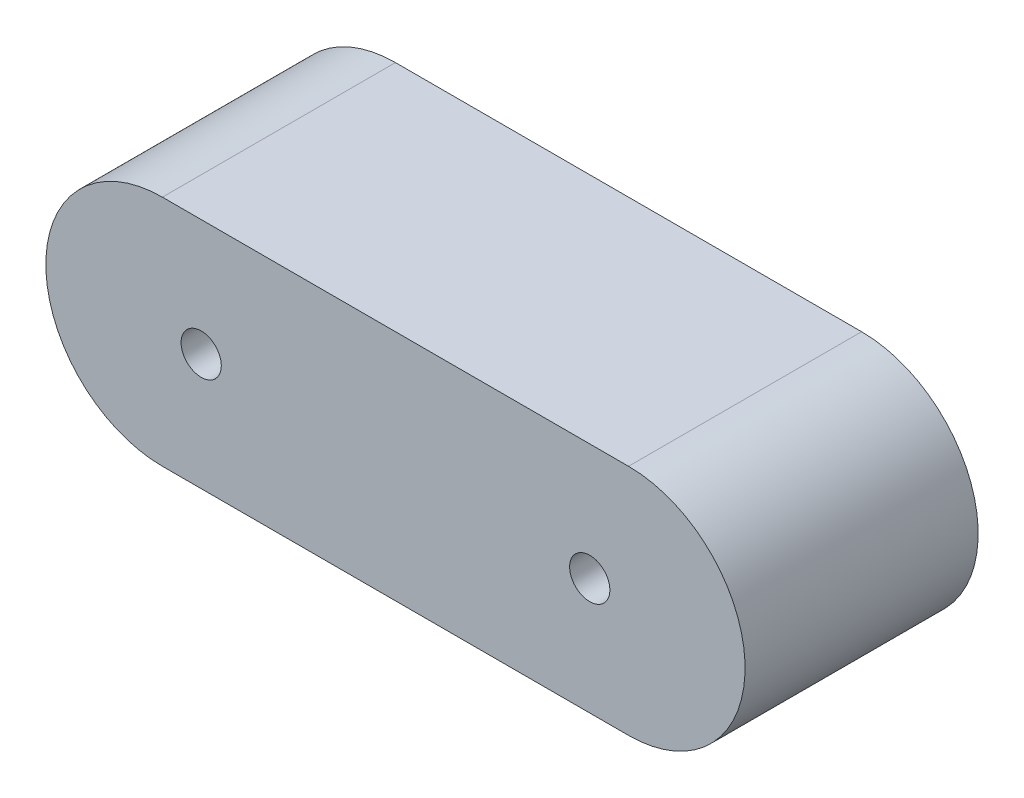
ISO-10303-21;
HEADER;
FILE_DESCRIPTION(('STEP AP214'),'2;1');
FILE_NAME('part.step','',(''),(''),'','','');
FILE_SCHEMA(('AUTOMOTIVE_DESIGN { 1 0 10303 214 1 1 1 1 }'));
ENDSEC;
DATA;
#1=APPLICATION_CONTEXT('core data for automotive mechanical design processes');
#2=APPLICATION_PROTOCOL_DEFINITION('international standard','automotive_design',2000,#1);
#3=PRODUCT_CONTEXT('',#1,'mechanical');
#4=PRODUCT('Part','Part','',(#3));
#5=PRODUCT_RELATED_PRODUCT_CATEGORY('part','',(#4));
#6=PRODUCT_DEFINITION_FORMATION('','',#4);
#7=PRODUCT_DEFINITION_CONTEXT('part definition',#1,'design');
#8=PRODUCT_DEFINITION('design','',#6,#7);
#9=PRODUCT_DEFINITION_SHAPE('','',#8);
#10=(LENGTH_UNIT() NAMED_UNIT(*) SI_UNIT(.MILLI.,.METRE.));
#11=(NAMED_UNIT(*) PLANE_ANGLE_UNIT() SI_UNIT($,.RADIAN.));
#12=(NAMED_UNIT(*) SI_UNIT($,.STERADIAN.) SOLID_ANGLE_UNIT());
#13=UNCERTAINTY_MEASURE_WITH_UNIT(LENGTH_MEASURE(1.E-05),#10,'distance_accuracy_value','');
#14=(GEOMETRIC_REPRESENTATION_CONTEXT(3) GLOBAL_UNCERTAINTY_ASSIGNED_CONTEXT((#13)) GLOBAL_UNIT_ASSIGNED_CONTEXT((#10,
#11,#12)) REPRESENTATION_CONTEXT('',''));
#15=CARTESIAN_POINT('',(0.,0.,0.));
#16=DIRECTION('',(0.,0.,1.));
#17=DIRECTION('',(1.,0.,0.));
#18=AXIS2_PLACEMENT_3D('',#15,#16,#17);
#19=CARTESIAN_POINT('',(-20.,0.,20.));
#20=DIRECTION('',(0.,0.,-1.));
#21=DIRECTION('',(-1.,0.,0.));
#22=AXIS2_PLACEMENT_3D('',#19,#20,#21);
#23=CYLINDRICAL_SURFACE('',#22,10.);
#24=CARTESIAN_POINT('',(-20.,0.,0.));
#25=DIRECTION('',(0.,0.,1.));
#26=DIRECTION('',(1.,0.,0.));
#27=AXIS2_PLACEMENT_3D('',#24,#25,#26);
#28=CIRCLE('',#27,10.);
#29=CARTESIAN_POINT('',(-20.,10.,0.));
#30=VERTEX_POINT('',#29);
#31=CARTESIAN_POINT('',(-20.,-10.,0.));
#32=VERTEX_POINT('',#31);
#33=EDGE_CURVE('E98',#30,#32,#28,.T.);
#34=ORIENTED_EDGE('',*,*,#33,.T.);
#35=DIRECTION('',(0.,0.,-1.));
#36=VECTOR('',#35,1.);
#37=CARTESIAN_POINT('',(-20.,-10.,20.));
#38=LINE('',#37,#36);
#39=CARTESIAN_POINT('',(-20.,-10.,20.));
#40=VERTEX_POINT('',#39);
#41=EDGE_CURVE('E11',#40,#32,#38,.T.);
#42=ORIENTED_EDGE('',*,*,#41,.F.);
#43=CARTESIAN_POINT('',(-20.,0.,20.));
#44=DIRECTION('',(0.,0.,1.));
#45=DIRECTION('',(1.,0.,0.));
#46=AXIS2_PLACEMENT_3D('',#43,#44,#45);
#47=CIRCLE('',#46,10.);
#48=CARTESIAN_POINT('',(-20.,10.,20.));
#49=VERTEX_POINT('',#48);
#50=EDGE_CURVE('E84',#49,#40,#47,.T.);
#51=ORIENTED_EDGE('',*,*,#50,.F.);
#52=DIRECTION('',(0.,0.,-1.));
#53=VECTOR('',#52,1.);
#54=CARTESIAN_POINT('',(-20.,10.,20.));
#55=LINE('',#54,#53);
#56=EDGE_CURVE('E51',#49,#30,#55,.T.);
#57=ORIENTED_EDGE('',*,*,#56,.T.);
#58=EDGE_LOOP('',(#34,#42,#51,#57));
#59=FACE_BOUND('',#58,.T.);
#60=ADVANCED_FACE('F35',(#59),#23,.T.);
#61=CARTESIAN_POINT('',(-20.,-10.,20.));
#62=DIRECTION('',(0.,1.,0.));
#63=DIRECTION('',(-1.,0.,0.));
#64=AXIS2_PLACEMENT_3D('',#61,#62,#63);
#65=PLANE('',#64);
#66=DIRECTION('',(1.,0.,0.));
#67=VECTOR('',#66,1.);
#68=CARTESIAN_POINT('',(-20.,-10.,0.));
#69=LINE('',#68,#67);
#70=CARTESIAN_POINT('',(20.,-9.99999999999999,0.));
#71=VERTEX_POINT('',#70);
#72=EDGE_CURVE('E89',#32,#71,#69,.T.);
#73=ORIENTED_EDGE('',*,*,#72,.T.);
#74=DIRECTION('',(0.,0.,-1.));
#75=VECTOR('',#74,1.);
#76=CARTESIAN_POINT('',(20.,-9.99999999999999,20.));
#77=LINE('',#76,#75);
#78=CARTESIAN_POINT('',(20.,-9.99999999999999,20.));
#79=VERTEX_POINT('',#78);
#80=EDGE_CURVE('E43',#79,#71,#77,.T.);
#81=ORIENTED_EDGE('',*,*,#80,.F.);
#82=DIRECTION('',(1.,0.,0.));
#83=VECTOR('',#82,1.);
#84=CARTESIAN_POINT('',(-20.,-10.,20.));
#85=LINE('',#84,#83);
#86=EDGE_CURVE('E77',#40,#79,#85,.T.);
#87=ORIENTED_EDGE('',*,*,#86,.F.);
#88=ORIENTED_EDGE('',*,*,#41,.T.);
#89=EDGE_LOOP('',(#73,#81,#87,#88));
#90=FACE_BOUND('',#89,.T.);
#91=ADVANCED_FACE('F88',(#90),#65,.F.);
#92=CARTESIAN_POINT('',(20.,0.,20.));
#93=DIRECTION('',(0.,0.,-1.));
#94=DIRECTION('',(-1.,0.,0.));
#95=AXIS2_PLACEMENT_3D('',#92,#93,#94);
#96=CYLINDRICAL_SURFACE('',#95,10.);
#97=CARTESIAN_POINT('',(20.,0.,0.));
#98=DIRECTION('',(0.,0.,1.));
#99=DIRECTION('',(1.,0.,0.));
#100=AXIS2_PLACEMENT_3D('',#97,#98,#99);
#101=CIRCLE('',#100,10.);
#102=CARTESIAN_POINT('',(20.,10.,0.));
#103=VERTEX_POINT('',#102);
#104=EDGE_CURVE('E102',#71,#103,#101,.T.);
#105=ORIENTED_EDGE('',*,*,#104,.T.);
#106=DIRECTION('',(0.,0.,-1.));
#107=VECTOR('',#106,1.);
#108=CARTESIAN_POINT('',(20.,10.,20.));
#109=LINE('',#108,#107);
#110=CARTESIAN_POINT('',(20.,10.,20.));
#111=VERTEX_POINT('',#110);
#112=EDGE_CURVE('E66',#111,#103,#109,.T.);
#113=ORIENTED_EDGE('',*,*,#112,.F.);
#114=CARTESIAN_POINT('',(20.,0.,20.));
#115=DIRECTION('',(0.,0.,1.));
#116=DIRECTION('',(1.,0.,0.));
#117=AXIS2_PLACEMENT_3D('',#114,#115,#116);
#118=CIRCLE('',#117,10.);
#119=EDGE_CURVE('E83',#79,#111,#118,.T.);
#120=ORIENTED_EDGE('',*,*,#119,.F.);
#121=ORIENTED_EDGE('',*,*,#80,.T.);
#122=EDGE_LOOP('',(#105,#113,#120,#121));
#123=FACE_BOUND('',#122,.T.);
#124=ADVANCED_FACE('F92',(#123),#96,.T.);
#125=CARTESIAN_POINT('',(-20.,10.,20.));
#126=DIRECTION('',(0.,1.,0.));
#127=DIRECTION('',(-1.,0.,0.));
#128=AXIS2_PLACEMENT_3D('',#125,#126,#127);
#129=PLANE('',#128);
#130=DIRECTION('',(1.,0.,0.));
#131=VECTOR('',#130,1.);
#132=CARTESIAN_POINT('',(-20.,10.,0.));
#133=LINE('',#132,#131);
#134=EDGE_CURVE('E104',#30,#103,#133,.T.);
#135=ORIENTED_EDGE('',*,*,#134,.F.);
#136=ORIENTED_EDGE('',*,*,#56,.F.);
#137=DIRECTION('',(1.,0.,0.));
#138=VECTOR('',#137,1.);
#139=CARTESIAN_POINT('',(-20.,10.,20.));
#140=LINE('',#139,#138);
#141=EDGE_CURVE('E93',#49,#111,#140,.T.);
#142=ORIENTED_EDGE('',*,*,#141,.T.);
#143=ORIENTED_EDGE('',*,*,#112,.T.);
#144=EDGE_LOOP('',(#135,#136,#142,#143));
#145=FACE_BOUND('',#144,.T.);
#146=ADVANCED_FACE('F134',(#145),#129,.T.);
#147=CARTESIAN_POINT('',(-20.,0.,20.));
#148=DIRECTION('',(0.,0.,1.));
#149=DIRECTION('',(1.,0.,0.));
#150=AXIS2_PLACEMENT_3D('',#147,#148,#149);
#151=PLANE('',#150);
#152=CARTESIAN_POINT('',(-16.6704734798408,0.,20.));
#153=DIRECTION('',(0.,0.,1.));
#154=DIRECTION('',(1.,0.,0.));
#155=AXIS2_PLACEMENT_3D('',#152,#153,#154);
#156=CIRCLE('',#155,1.72580195215109);
#157=CARTESIAN_POINT('',(-14.9446715276897,0.,20.));
#158=VERTEX_POINT('',#157);
#159=EDGE_CURVE('E116',#158,#158,#156,.T.);
#160=ORIENTED_EDGE('',*,*,#159,.F.);
#161=EDGE_LOOP('',(#160));
#162=FACE_BOUND('',#161,.T.);
#163=CARTESIAN_POINT('',(16.6704734798408,-1.16409294129087E-13,20.));
#164=DIRECTION('',(0.,0.,1.));
#165=DIRECTION('',(1.,0.,0.));
#166=AXIS2_PLACEMENT_3D('',#163,#164,#165);
#167=CIRCLE('',#166,1.72580195215109);
#168=CARTESIAN_POINT('',(18.3962754319919,-1.16409294129087E-13,20.));
#169=VERTEX_POINT('',#168);
#170=EDGE_CURVE('E110',#169,#169,#167,.T.);
#171=ORIENTED_EDGE('',*,*,#170,.F.);
#172=EDGE_LOOP('',(#171));
#173=FACE_BOUND('',#172,.T.);
#174=ORIENTED_EDGE('',*,*,#50,.T.);
#175=ORIENTED_EDGE('',*,*,#86,.T.);
#176=ORIENTED_EDGE('',*,*,#119,.T.);
#177=ORIENTED_EDGE('',*,*,#141,.F.);
#178=EDGE_LOOP('',(#174,#175,#176,#177));
#179=FACE_BOUND('',#178,.T.);
#180=ADVANCED_FACE('F80',(#162,#173,#179),#151,.T.);
#181=CARTESIAN_POINT('',(-20.,0.,0.));
#182=DIRECTION('',(0.,0.,1.));
#183=DIRECTION('',(1.,0.,0.));
#184=AXIS2_PLACEMENT_3D('',#181,#182,#183);
#185=PLANE('',#184);
#186=ORIENTED_EDGE('',*,*,#33,.F.);
#187=ORIENTED_EDGE('',*,*,#134,.T.);
#188=ORIENTED_EDGE('',*,*,#104,.F.);
#189=ORIENTED_EDGE('',*,*,#72,.F.);
#190=EDGE_LOOP('',(#186,#187,#188,#189));
#191=FACE_BOUND('',#190,.T.);
#192=ADVANCED_FACE('F133',(#191),#185,.F.);
#193=CARTESIAN_POINT('',(16.6704734798408,-1.16409294129087E-13,12.));
#194=DIRECTION('',(0.,0.,1.));
#195=DIRECTION('',(1.,0.,0.));
#196=AXIS2_PLACEMENT_3D('',#193,#194,#195);
#197=CYLINDRICAL_SURFACE('',#196,1.72580195215109);
#198=CARTESIAN_POINT('',(16.6704734798408,-1.16409294129087E-13,12.));
#199=DIRECTION('',(0.,0.,1.));
#200=DIRECTION('',(1.,0.,0.));
#201=AXIS2_PLACEMENT_3D('',#198,#199,#200);
#202=CIRCLE('',#201,1.72580195215109);
#203=CARTESIAN_POINT('',(18.3962754319919,-1.16409294129087E-13,12.));
#204=VERTEX_POINT('',#203);
#205=EDGE_CURVE('E113',#204,#204,#202,.T.);
#206=ORIENTED_EDGE('',*,*,#205,.F.);
#207=EDGE_LOOP('',(#206));
#208=FACE_BOUND('',#207,.T.);
#209=ORIENTED_EDGE('',*,*,#170,.T.);
#210=EDGE_LOOP('',(#209));
#211=FACE_BOUND('',#210,.T.);
#212=ADVANCED_FACE('F138',(#208,#211),#197,.F.);
#213=CARTESIAN_POINT('',(16.6704734798408,-1.16409294129087E-13,12.));
#214=DIRECTION('',(0.,0.,1.));
#215=DIRECTION('',(1.,0.,0.));
#216=AXIS2_PLACEMENT_3D('',#213,#214,#215);
#217=PLANE('',#216);
#218=ORIENTED_EDGE('',*,*,#205,.T.);
#219=EDGE_LOOP('',(#218));
#220=FACE_BOUND('',#219,.T.);
#221=ADVANCED_FACE('F127',(#220),#217,.T.);
#222=CARTESIAN_POINT('',(-16.6704734798408,0.,12.));
#223=DIRECTION('',(0.,0.,1.));
#224=DIRECTION('',(1.,0.,0.));
#225=AXIS2_PLACEMENT_3D('',#222,#223,#224);
#226=CYLINDRICAL_SURFACE('',#225,1.72580195215109);
#227=CARTESIAN_POINT('',(-16.6704734798408,0.,12.));
#228=DIRECTION('',(0.,0.,1.));
#229=DIRECTION('',(1.,0.,0.));
#230=AXIS2_PLACEMENT_3D('',#227,#228,#229);
#231=CIRCLE('',#230,1.72580195215109);
#232=CARTESIAN_POINT('',(-14.9446715276897,0.,12.));
#233=VERTEX_POINT('',#232);
#234=EDGE_CURVE('E100',#233,#233,#231,.T.);
#235=ORIENTED_EDGE('',*,*,#234,.F.);
#236=EDGE_LOOP('',(#235));
#237=FACE_BOUND('',#236,.T.);
#238=ORIENTED_EDGE('',*,*,#159,.T.);
#239=EDGE_LOOP('',(#238));
#240=FACE_BOUND('',#239,.T.);
#241=ADVANCED_FACE('F124',(#237,#240),#226,.F.);
#242=CARTESIAN_POINT('',(-16.6704734798408,0.,12.));
#243=DIRECTION('',(0.,0.,1.));
#244=DIRECTION('',(1.,0.,0.));
#245=AXIS2_PLACEMENT_3D('',#242,#243,#244);
#246=PLANE('',#245);
#247=ORIENTED_EDGE('',*,*,#234,.T.);
#248=EDGE_LOOP('',(#247));
#249=FACE_BOUND('',#248,.T.);
#250=ADVANCED_FACE('F122',(#249),#246,.T.);
#251=CLOSED_SHELL('',(#60,#91,#124,#146,#180,#192,#212,#221,#241,#250));
#252=MANIFOLD_SOLID_BREP('B2',#251);
#253=ADVANCED_BREP_SHAPE_REPRESENTATION('',(#18,#252),#14);
#254=SHAPE_DEFINITION_REPRESENTATION(#9,#253);
ENDSEC;
END-ISO-10303-21;
